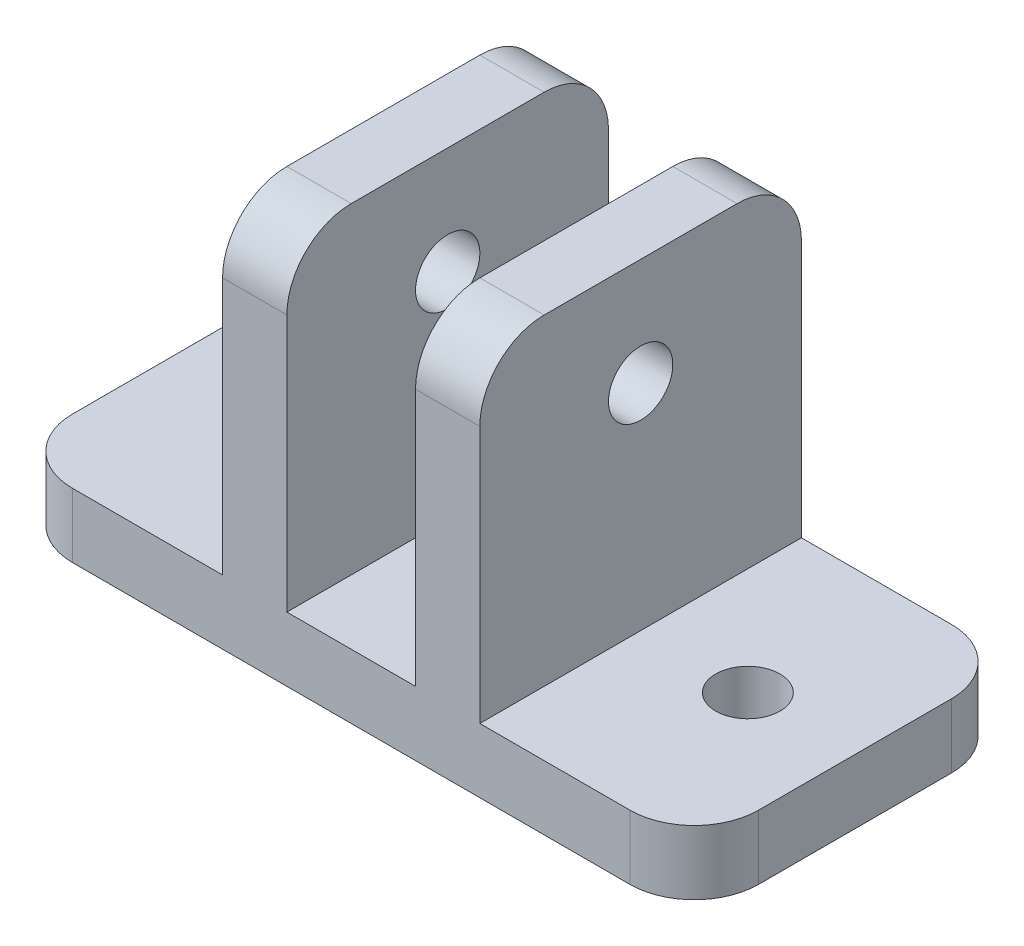
ISO-10303-21;
HEADER;
FILE_DESCRIPTION(('STEP AP214'),'2;1');
FILE_NAME('part.step','',(''),(''),'','','');
FILE_SCHEMA(('AUTOMOTIVE_DESIGN { 1 0 10303 214 1 1 1 1 }'));
ENDSEC;
DATA;
#1=APPLICATION_CONTEXT('core data for automotive mechanical design processes');
#2=APPLICATION_PROTOCOL_DEFINITION('international standard','automotive_design',2000,#1);
#3=PRODUCT_CONTEXT('',#1,'mechanical');
#4=PRODUCT('Part','Part','',(#3));
#5=PRODUCT_RELATED_PRODUCT_CATEGORY('part','',(#4));
#6=PRODUCT_DEFINITION_FORMATION('','',#4);
#7=PRODUCT_DEFINITION_CONTEXT('part definition',#1,'design');
#8=PRODUCT_DEFINITION('design','',#6,#7);
#9=PRODUCT_DEFINITION_SHAPE('','',#8);
#10=(LENGTH_UNIT() NAMED_UNIT(*) SI_UNIT(.MILLI.,.METRE.));
#11=(NAMED_UNIT(*) PLANE_ANGLE_UNIT() SI_UNIT($,.RADIAN.));
#12=(NAMED_UNIT(*) SI_UNIT($,.STERADIAN.) SOLID_ANGLE_UNIT());
#13=UNCERTAINTY_MEASURE_WITH_UNIT(LENGTH_MEASURE(1.E-05),#10,'distance_accuracy_value','');
#14=(GEOMETRIC_REPRESENTATION_CONTEXT(3) GLOBAL_UNCERTAINTY_ASSIGNED_CONTEXT((#13)) GLOBAL_UNIT_ASSIGNED_CONTEXT((#10,
#11,#12)) REPRESENTATION_CONTEXT('',''));
#15=CARTESIAN_POINT('',(0.,0.,0.));
#16=DIRECTION('',(0.,0.,1.));
#17=DIRECTION('',(1.,0.,0.));
#18=AXIS2_PLACEMENT_3D('',#15,#16,#17);
#19=CARTESIAN_POINT('',(-19.,3.,7.5));
#20=DIRECTION('',(0.,0.,-1.));
#21=DIRECTION('',(-1.,0.,0.));
#22=AXIS2_PLACEMENT_3D('',#19,#20,#21);
#23=PLANE('',#22);
#24=DIRECTION('',(-1.,0.,0.));
#25=VECTOR('',#24,1.);
#26=CARTESIAN_POINT('',(5.99999999999999,15.,7.5));
#27=LINE('',#26,#25);
#28=CARTESIAN_POINT('',(-6.00000000000002,15.,7.5));
#29=VERTEX_POINT('',#28);
#30=CARTESIAN_POINT('',(-9.00000000000001,15.,7.5));
#31=VERTEX_POINT('',#30);
#32=EDGE_CURVE('E309',#29,#31,#27,.T.);
#33=ORIENTED_EDGE('',*,*,#32,.T.);
#34=DIRECTION('',(0.,-1.,0.));
#35=VECTOR('',#34,1.);
#36=CARTESIAN_POINT('',(-9.00000000000001,18.,7.5));
#37=LINE('',#36,#35);
#38=CARTESIAN_POINT('',(-9.00000000000001,3.,7.5));
#39=VERTEX_POINT('',#38);
#40=EDGE_CURVE('E218',#31,#39,#37,.T.);
#41=ORIENTED_EDGE('',*,*,#40,.T.);
#42=DIRECTION('',(1.,0.,0.));
#43=VECTOR('',#42,1.);
#44=CARTESIAN_POINT('',(-19.,3.,7.5));
#45=LINE('',#44,#43);
#46=CARTESIAN_POINT('',(-16.,3.,7.5));
#47=VERTEX_POINT('',#46);
#48=EDGE_CURVE('E232',#47,#39,#45,.T.);
#49=ORIENTED_EDGE('',*,*,#48,.F.);
#50=DIRECTION('',(0.,1.,0.));
#51=VECTOR('',#50,1.);
#52=CARTESIAN_POINT('',(-16.,-12.,7.5));
#53=LINE('',#52,#51);
#54=CARTESIAN_POINT('',(-16.,0.,7.5));
#55=VERTEX_POINT('',#54);
#56=EDGE_CURVE('E342',#55,#47,#53,.T.);
#57=ORIENTED_EDGE('',*,*,#56,.F.);
#58=DIRECTION('',(1.,0.,0.));
#59=VECTOR('',#58,1.);
#60=CARTESIAN_POINT('',(-19.,0.,7.5));
#61=LINE('',#60,#59);
#62=CARTESIAN_POINT('',(9.99999999999998,0.,7.5));
#63=VERTEX_POINT('',#62);
#64=EDGE_CURVE('E245',#55,#63,#61,.T.);
#65=ORIENTED_EDGE('',*,*,#64,.T.);
#66=DIRECTION('',(0.,1.,0.));
#67=VECTOR('',#66,1.);
#68=CARTESIAN_POINT('',(9.99999999999998,-12.,7.5));
#69=LINE('',#68,#67);
#70=CARTESIAN_POINT('',(9.99999999999998,3.,7.5));
#71=VERTEX_POINT('',#70);
#72=EDGE_CURVE('E341',#63,#71,#69,.T.);
#73=ORIENTED_EDGE('',*,*,#72,.T.);
#74=CARTESIAN_POINT('',(2.99999999999998,3.,7.5));
#75=VERTEX_POINT('',#74);
#76=EDGE_CURVE('E231',#75,#71,#45,.T.);
#77=ORIENTED_EDGE('',*,*,#76,.F.);
#78=DIRECTION('',(0.,-1.,0.));
#79=VECTOR('',#78,1.);
#80=CARTESIAN_POINT('',(2.99999999999998,18.,7.5));
#81=LINE('',#80,#79);
#82=CARTESIAN_POINT('',(2.99999999999998,15.,7.5));
#83=VERTEX_POINT('',#82);
#84=EDGE_CURVE('E402',#83,#75,#81,.T.);
#85=ORIENTED_EDGE('',*,*,#84,.F.);
#86=CARTESIAN_POINT('',(0.,15.,7.5));
#87=VERTEX_POINT('',#86);
#88=EDGE_CURVE('E312',#83,#87,#27,.T.);
#89=ORIENTED_EDGE('',*,*,#88,.T.);
#90=DIRECTION('',(0.,-1.,0.));
#91=VECTOR('',#90,1.);
#92=CARTESIAN_POINT('',(0.,18.,7.5));
#93=LINE('',#92,#91);
#94=CARTESIAN_POINT('',(0.,3.,7.5));
#95=VERTEX_POINT('',#94);
#96=EDGE_CURVE('E405',#87,#95,#93,.T.);
#97=ORIENTED_EDGE('',*,*,#96,.T.);
#98=CARTESIAN_POINT('',(-6.00000000000002,3.,7.5));
#99=VERTEX_POINT('',#98);
#100=EDGE_CURVE('E237',#99,#95,#45,.T.);
#101=ORIENTED_EDGE('',*,*,#100,.F.);
#102=DIRECTION('',(0.,-1.,0.));
#103=VECTOR('',#102,1.);
#104=CARTESIAN_POINT('',(-6.00000000000002,18.,7.5));
#105=LINE('',#104,#103);
#106=EDGE_CURVE('E208',#29,#99,#105,.T.);
#107=ORIENTED_EDGE('',*,*,#106,.F.);
#108=EDGE_LOOP('',(#33,#41,#49,#57,#65,#73,#77,#85,#89,#97,#101,#107));
#109=FACE_BOUND('',#108,.T.);
#110=ADVANCED_FACE('F39',(#109),#23,.F.);
#111=CARTESIAN_POINT('',(0.,18.,0.));
#112=DIRECTION('',(0.,1.,0.));
#113=DIRECTION('',(0.,0.,1.));
#114=AXIS2_PLACEMENT_3D('',#111,#112,#113);
#115=PLANE('',#114);
#116=DIRECTION('',(-1.,0.,0.));
#117=VECTOR('',#116,1.);
#118=CARTESIAN_POINT('',(5.99999999999999,18.,-4.49999999999999));
#119=LINE('',#118,#117);
#120=CARTESIAN_POINT('',(-6.00000000000002,18.,-4.49999999999999));
#121=VERTEX_POINT('',#120);
#122=CARTESIAN_POINT('',(-9.00000000000001,18.,-4.49999999999999));
#123=VERTEX_POINT('',#122);
#124=EDGE_CURVE('E303',#121,#123,#119,.T.);
#125=ORIENTED_EDGE('',*,*,#124,.T.);
#126=DIRECTION('',(0.,0.,1.));
#127=VECTOR('',#126,1.);
#128=CARTESIAN_POINT('',(-9.00000000000001,18.,-7.5));
#129=LINE('',#128,#127);
#130=CARTESIAN_POINT('',(-9.00000000000001,18.,4.49999999999999));
#131=VERTEX_POINT('',#130);
#132=EDGE_CURVE('E194',#123,#131,#129,.T.);
#133=ORIENTED_EDGE('',*,*,#132,.T.);
#134=DIRECTION('',(-1.,0.,0.));
#135=VECTOR('',#134,1.);
#136=CARTESIAN_POINT('',(5.99999999999999,18.,4.49999999999999));
#137=LINE('',#136,#135);
#138=CARTESIAN_POINT('',(-6.00000000000002,18.,4.5));
#139=VERTEX_POINT('',#138);
#140=EDGE_CURVE('E196',#139,#131,#137,.T.);
#141=ORIENTED_EDGE('',*,*,#140,.F.);
#142=DIRECTION('',(0.,0.,-1.));
#143=VECTOR('',#142,1.);
#144=CARTESIAN_POINT('',(-6.00000000000002,18.,-7.5));
#145=LINE('',#144,#143);
#146=EDGE_CURVE('E204',#139,#121,#145,.T.);
#147=ORIENTED_EDGE('',*,*,#146,.T.);
#148=EDGE_LOOP('',(#125,#133,#141,#147));
#149=FACE_BOUND('',#148,.T.);
#150=ADVANCED_FACE('F485',(#149),#115,.T.);
#151=CARTESIAN_POINT('',(0.,18.,0.));
#152=DIRECTION('',(0.,1.,0.));
#153=DIRECTION('',(0.,0.,1.));
#154=AXIS2_PLACEMENT_3D('',#151,#152,#153);
#155=PLANE('',#154);
#156=DIRECTION('',(-1.,0.,0.));
#157=VECTOR('',#156,1.);
#158=CARTESIAN_POINT('',(5.99999999999999,18.,-4.5));
#159=LINE('',#158,#157);
#160=CARTESIAN_POINT('',(0.,18.,-4.5));
#161=VERTEX_POINT('',#160);
#162=CARTESIAN_POINT('',(2.99999999999998,18.,-4.49999999999999));
#163=VERTEX_POINT('',#162);
#164=EDGE_CURVE('E11',#161,#163,#159,.F.);
#165=ORIENTED_EDGE('',*,*,#164,.F.);
#166=DIRECTION('',(0.,0.,1.));
#167=VECTOR('',#166,1.);
#168=CARTESIAN_POINT('',(0.,18.,-7.5));
#169=LINE('',#168,#167);
#170=CARTESIAN_POINT('',(0.,18.,4.49999999999999));
#171=VERTEX_POINT('',#170);
#172=EDGE_CURVE('E381',#161,#171,#169,.T.);
#173=ORIENTED_EDGE('',*,*,#172,.T.);
#174=DIRECTION('',(-1.,0.,0.));
#175=VECTOR('',#174,1.);
#176=CARTESIAN_POINT('',(5.99999999999999,18.,4.5));
#177=LINE('',#176,#175);
#178=CARTESIAN_POINT('',(2.99999999999998,18.,4.5));
#179=VERTEX_POINT('',#178);
#180=EDGE_CURVE('E49',#171,#179,#177,.F.);
#181=ORIENTED_EDGE('',*,*,#180,.T.);
#182=DIRECTION('',(0.,0.,-1.));
#183=VECTOR('',#182,1.);
#184=CARTESIAN_POINT('',(2.99999999999998,18.,-7.5));
#185=LINE('',#184,#183);
#186=EDGE_CURVE('E385',#179,#163,#185,.T.);
#187=ORIENTED_EDGE('',*,*,#186,.T.);
#188=EDGE_LOOP('',(#165,#173,#181,#187));
#189=FACE_BOUND('',#188,.T.);
#190=ADVANCED_FACE('F464',(#189),#155,.T.);
#191=CARTESIAN_POINT('',(0.,3.,0.));
#192=DIRECTION('',(0.,1.,0.));
#193=DIRECTION('',(0.,0.,1.));
#194=AXIS2_PLACEMENT_3D('',#191,#192,#193);
#195=PLANE('',#194);
#196=CARTESIAN_POINT('',(7.99999999999998,3.,0.));
#197=DIRECTION('',(0.,1.,0.));
#198=DIRECTION('',(0.,0.,1.));
#199=AXIS2_PLACEMENT_3D('',#196,#197,#198);
#200=CIRCLE('',#199,1.5);
#201=CARTESIAN_POINT('',(7.99999999999998,3.,1.5));
#202=VERTEX_POINT('',#201);
#203=EDGE_CURVE('E284',#202,#202,#200,.T.);
#204=ORIENTED_EDGE('',*,*,#203,.F.);
#205=EDGE_LOOP('',(#204));
#206=FACE_BOUND('',#205,.T.);
#207=CARTESIAN_POINT('',(9.99999999999998,3.,-4.5));
#208=DIRECTION('',(0.,1.,0.));
#209=DIRECTION('',(0.,0.,1.));
#210=AXIS2_PLACEMENT_3D('',#207,#208,#209);
#211=CIRCLE('',#210,3.);
#212=CARTESIAN_POINT('',(9.99999999999998,3.,-7.5));
#213=VERTEX_POINT('',#212);
#214=CARTESIAN_POINT('',(13.,3.,-4.5));
#215=VERTEX_POINT('',#214);
#216=EDGE_CURVE('E335',#213,#215,#211,.F.);
#217=ORIENTED_EDGE('',*,*,#216,.F.);
#218=DIRECTION('',(-1.,0.,0.));
#219=VECTOR('',#218,1.);
#220=CARTESIAN_POINT('',(-19.,3.,-7.5));
#221=LINE('',#220,#219);
#222=CARTESIAN_POINT('',(2.99999999999998,3.,-7.5));
#223=VERTEX_POINT('',#222);
#224=EDGE_CURVE('E222',#213,#223,#221,.T.);
#225=ORIENTED_EDGE('',*,*,#224,.T.);
#226=DIRECTION('',(0.,0.,-1.));
#227=VECTOR('',#226,1.);
#228=CARTESIAN_POINT('',(2.99999999999998,3.,-7.5));
#229=LINE('',#228,#227);
#230=EDGE_CURVE('E386',#75,#223,#229,.T.);
#231=ORIENTED_EDGE('',*,*,#230,.F.);
#232=ORIENTED_EDGE('',*,*,#76,.T.);
#233=CARTESIAN_POINT('',(9.99999999999998,3.,4.5));
#234=DIRECTION('',(0.,1.,0.));
#235=DIRECTION('',(0.,0.,1.));
#236=AXIS2_PLACEMENT_3D('',#233,#234,#235);
#237=CIRCLE('',#236,3.);
#238=CARTESIAN_POINT('',(13.,3.,4.5));
#239=VERTEX_POINT('',#238);
#240=EDGE_CURVE('E349',#239,#71,#237,.F.);
#241=ORIENTED_EDGE('',*,*,#240,.F.);
#242=DIRECTION('',(0.,0.,1.));
#243=VECTOR('',#242,1.);
#244=CARTESIAN_POINT('',(13.,3.,-7.5));
#245=LINE('',#244,#243);
#246=EDGE_CURVE('E376',#215,#239,#245,.T.);
#247=ORIENTED_EDGE('',*,*,#246,.F.);
#248=EDGE_LOOP('',(#217,#225,#231,#232,#241,#247));
#249=FACE_BOUND('',#248,.T.);
#250=ADVANCED_FACE('F436',(#206,#249),#195,.T.);
#251=CARTESIAN_POINT('',(-14.,3.,0.));
#252=DIRECTION('',(0.,1.,0.));
#253=DIRECTION('',(0.,0.,1.));
#254=AXIS2_PLACEMENT_3D('',#251,#252,#253);
#255=CIRCLE('',#254,1.5);
#256=CARTESIAN_POINT('',(-14.,3.,1.5));
#257=VERTEX_POINT('',#256);
#258=EDGE_CURVE('E277',#257,#257,#255,.T.);
#259=ORIENTED_EDGE('',*,*,#258,.F.);
#260=EDGE_LOOP('',(#259));
#261=FACE_BOUND('',#260,.T.);
#262=DIRECTION('',(0.,0.,1.));
#263=VECTOR('',#262,1.);
#264=CARTESIAN_POINT('',(-19.,3.,-7.5));
#265=LINE('',#264,#263);
#266=CARTESIAN_POINT('',(-19.,3.,-4.5));
#267=VERTEX_POINT('',#266);
#268=CARTESIAN_POINT('',(-19.,3.,4.5));
#269=VERTEX_POINT('',#268);
#270=EDGE_CURVE('E226',#267,#269,#265,.T.);
#271=ORIENTED_EDGE('',*,*,#270,.T.);
#272=CARTESIAN_POINT('',(-16.,3.,4.5));
#273=DIRECTION('',(0.,1.,0.));
#274=DIRECTION('',(0.,0.,1.));
#275=AXIS2_PLACEMENT_3D('',#272,#273,#274);
#276=CIRCLE('',#275,3.);
#277=EDGE_CURVE('E336',#269,#47,#276,.T.);
#278=ORIENTED_EDGE('',*,*,#277,.T.);
#279=ORIENTED_EDGE('',*,*,#48,.T.);
#280=DIRECTION('',(0.,0.,1.));
#281=VECTOR('',#280,1.);
#282=CARTESIAN_POINT('',(-9.00000000000001,3.,-7.5));
#283=LINE('',#282,#281);
#284=CARTESIAN_POINT('',(-9.00000000000001,3.,-7.5));
#285=VERTEX_POINT('',#284);
#286=EDGE_CURVE('E408',#285,#39,#283,.T.);
#287=ORIENTED_EDGE('',*,*,#286,.F.);
#288=CARTESIAN_POINT('',(-16.,3.,-7.5));
#289=VERTEX_POINT('',#288);
#290=EDGE_CURVE('E201',#285,#289,#221,.T.);
#291=ORIENTED_EDGE('',*,*,#290,.T.);
#292=CARTESIAN_POINT('',(-16.,3.,-4.5));
#293=DIRECTION('',(0.,1.,0.));
#294=DIRECTION('',(0.,0.,1.));
#295=AXIS2_PLACEMENT_3D('',#292,#293,#294);
#296=CIRCLE('',#295,3.);
#297=EDGE_CURVE('E345',#267,#289,#296,.F.);
#298=ORIENTED_EDGE('',*,*,#297,.F.);
#299=EDGE_LOOP('',(#271,#278,#279,#287,#291,#298));
#300=FACE_BOUND('',#299,.T.);
#301=ADVANCED_FACE('F503',(#261,#300),#195,.T.);
#302=CARTESIAN_POINT('',(-19.,3.,-7.5));
#303=DIRECTION('',(0.,0.,1.));
#304=DIRECTION('',(1.,0.,0.));
#305=AXIS2_PLACEMENT_3D('',#302,#303,#304);
#306=PLANE('',#305);
#307=DIRECTION('',(0.,-1.,0.));
#308=VECTOR('',#307,1.);
#309=CARTESIAN_POINT('',(-9.00000000000001,18.,-7.5));
#310=LINE('',#309,#308);
#311=CARTESIAN_POINT('',(-9.00000000000001,15.,-7.5));
#312=VERTEX_POINT('',#311);
#313=EDGE_CURVE('E190',#312,#285,#310,.T.);
#314=ORIENTED_EDGE('',*,*,#313,.F.);
#315=DIRECTION('',(-1.,0.,0.));
#316=VECTOR('',#315,1.);
#317=CARTESIAN_POINT('',(5.99999999999999,15.,-7.5));
#318=LINE('',#317,#316);
#319=CARTESIAN_POINT('',(-6.00000000000002,15.,-7.5));
#320=VERTEX_POINT('',#319);
#321=EDGE_CURVE('E176',#320,#312,#318,.T.);
#322=ORIENTED_EDGE('',*,*,#321,.F.);
#323=DIRECTION('',(0.,-1.,0.));
#324=VECTOR('',#323,1.);
#325=CARTESIAN_POINT('',(-6.00000000000002,18.,-7.5));
#326=LINE('',#325,#324);
#327=CARTESIAN_POINT('',(-6.00000000000002,3.,-7.5));
#328=VERTEX_POINT('',#327);
#329=EDGE_CURVE('E203',#320,#328,#326,.T.);
#330=ORIENTED_EDGE('',*,*,#329,.T.);
#331=CARTESIAN_POINT('',(0.,3.,-7.5));
#332=VERTEX_POINT('',#331);
#333=EDGE_CURVE('E227',#332,#328,#221,.T.);
#334=ORIENTED_EDGE('',*,*,#333,.F.);
#335=DIRECTION('',(0.,-1.,0.));
#336=VECTOR('',#335,1.);
#337=CARTESIAN_POINT('',(0.,18.,-7.5));
#338=LINE('',#337,#336);
#339=CARTESIAN_POINT('',(0.,15.,-7.5));
#340=VERTEX_POINT('',#339);
#341=EDGE_CURVE('E390',#340,#332,#338,.T.);
#342=ORIENTED_EDGE('',*,*,#341,.F.);
#343=CARTESIAN_POINT('',(2.99999999999998,15.,-7.5));
#344=VERTEX_POINT('',#343);
#345=EDGE_CURVE('E184',#344,#340,#318,.T.);
#346=ORIENTED_EDGE('',*,*,#345,.F.);
#347=DIRECTION('',(0.,-1.,0.));
#348=VECTOR('',#347,1.);
#349=CARTESIAN_POINT('',(2.99999999999998,18.,-7.5));
#350=LINE('',#349,#348);
#351=EDGE_CURVE('E399',#344,#223,#350,.T.);
#352=ORIENTED_EDGE('',*,*,#351,.T.);
#353=ORIENTED_EDGE('',*,*,#224,.F.);
#354=DIRECTION('',(0.,1.,0.));
#355=VECTOR('',#354,1.);
#356=CARTESIAN_POINT('',(9.99999999999998,-12.,-7.5));
#357=LINE('',#356,#355);
#358=CARTESIAN_POINT('',(9.99999999999998,0.,-7.5));
#359=VERTEX_POINT('',#358);
#360=EDGE_CURVE('E352',#359,#213,#357,.T.);
#361=ORIENTED_EDGE('',*,*,#360,.F.);
#362=DIRECTION('',(-1.,0.,0.));
#363=VECTOR('',#362,1.);
#364=CARTESIAN_POINT('',(-19.,0.,-7.5));
#365=LINE('',#364,#363);
#366=CARTESIAN_POINT('',(-16.,0.,-7.5));
#367=VERTEX_POINT('',#366);
#368=EDGE_CURVE('E221',#359,#367,#365,.T.);
#369=ORIENTED_EDGE('',*,*,#368,.T.);
#370=DIRECTION('',(0.,1.,0.));
#371=VECTOR('',#370,1.);
#372=CARTESIAN_POINT('',(-16.,-12.,-7.5));
#373=LINE('',#372,#371);
#374=EDGE_CURVE('E363',#367,#289,#373,.T.);
#375=ORIENTED_EDGE('',*,*,#374,.T.);
#376=ORIENTED_EDGE('',*,*,#290,.F.);
#377=EDGE_LOOP('',(#314,#322,#330,#334,#342,#346,#352,#353,#361,#369,#375,#376));
#378=FACE_BOUND('',#377,.T.);
#379=ADVANCED_FACE('F41',(#378),#306,.F.);
#380=CARTESIAN_POINT('',(0.,0.,0.));
#381=DIRECTION('',(0.,1.,0.));
#382=DIRECTION('',(0.,0.,1.));
#383=AXIS2_PLACEMENT_3D('',#380,#381,#382);
#384=PLANE('',#383);
#385=CARTESIAN_POINT('',(-14.,0.,0.));
#386=DIRECTION('',(0.,1.,0.));
#387=DIRECTION('',(0.,0.,1.));
#388=AXIS2_PLACEMENT_3D('',#385,#386,#387);
#389=CIRCLE('',#388,1.5);
#390=CARTESIAN_POINT('',(-14.,0.,1.5));
#391=VERTEX_POINT('',#390);
#392=EDGE_CURVE('E43',#391,#391,#389,.T.);
#393=ORIENTED_EDGE('',*,*,#392,.T.);
#394=EDGE_LOOP('',(#393));
#395=FACE_BOUND('',#394,.T.);
#396=CARTESIAN_POINT('',(7.99999999999998,0.,0.));
#397=DIRECTION('',(0.,1.,0.));
#398=DIRECTION('',(0.,0.,1.));
#399=AXIS2_PLACEMENT_3D('',#396,#397,#398);
#400=CIRCLE('',#399,1.5);
#401=CARTESIAN_POINT('',(7.99999999999998,0.,1.5));
#402=VERTEX_POINT('',#401);
#403=EDGE_CURVE('E274',#402,#402,#400,.T.);
#404=ORIENTED_EDGE('',*,*,#403,.T.);
#405=EDGE_LOOP('',(#404));
#406=FACE_BOUND('',#405,.T.);
#407=ORIENTED_EDGE('',*,*,#368,.F.);
#408=CARTESIAN_POINT('',(9.99999999999998,0.,-4.5));
#409=DIRECTION('',(0.,1.,0.));
#410=DIRECTION('',(0.,0.,1.));
#411=AXIS2_PLACEMENT_3D('',#408,#409,#410);
#412=CIRCLE('',#411,3.);
#413=CARTESIAN_POINT('',(13.,0.,-4.5));
#414=VERTEX_POINT('',#413);
#415=EDGE_CURVE('E372',#359,#414,#412,.F.);
#416=ORIENTED_EDGE('',*,*,#415,.T.);
#417=DIRECTION('',(0.,0.,1.));
#418=VECTOR('',#417,1.);
#419=CARTESIAN_POINT('',(13.,0.,0.));
#420=LINE('',#419,#418);
#421=CARTESIAN_POINT('',(13.,0.,4.5));
#422=VERTEX_POINT('',#421);
#423=EDGE_CURVE('E236',#414,#422,#420,.T.);
#424=ORIENTED_EDGE('',*,*,#423,.T.);
#425=CARTESIAN_POINT('',(9.99999999999998,0.,4.5));
#426=DIRECTION('',(0.,1.,0.));
#427=DIRECTION('',(0.,0.,1.));
#428=AXIS2_PLACEMENT_3D('',#425,#426,#427);
#429=CIRCLE('',#428,3.);
#430=EDGE_CURVE('E366',#422,#63,#429,.F.);
#431=ORIENTED_EDGE('',*,*,#430,.T.);
#432=ORIENTED_EDGE('',*,*,#64,.F.);
#433=CARTESIAN_POINT('',(-16.,0.,4.5));
#434=DIRECTION('',(0.,1.,0.));
#435=DIRECTION('',(0.,0.,1.));
#436=AXIS2_PLACEMENT_3D('',#433,#434,#435);
#437=CIRCLE('',#436,3.);
#438=CARTESIAN_POINT('',(-19.,0.,4.5));
#439=VERTEX_POINT('',#438);
#440=EDGE_CURVE('E263',#439,#55,#437,.T.);
#441=ORIENTED_EDGE('',*,*,#440,.F.);
#442=DIRECTION('',(0.,0.,1.));
#443=VECTOR('',#442,1.);
#444=CARTESIAN_POINT('',(-19.,0.,-7.5));
#445=LINE('',#444,#443);
#446=CARTESIAN_POINT('',(-19.,0.,-4.5));
#447=VERTEX_POINT('',#446);
#448=EDGE_CURVE('E241',#447,#439,#445,.T.);
#449=ORIENTED_EDGE('',*,*,#448,.F.);
#450=CARTESIAN_POINT('',(-16.,0.,-4.5));
#451=DIRECTION('',(0.,1.,0.));
#452=DIRECTION('',(0.,0.,1.));
#453=AXIS2_PLACEMENT_3D('',#450,#451,#452);
#454=CIRCLE('',#453,3.);
#455=EDGE_CURVE('E259',#447,#367,#454,.F.);
#456=ORIENTED_EDGE('',*,*,#455,.T.);
#457=EDGE_LOOP('',(#407,#416,#424,#431,#432,#441,#449,#456));
#458=FACE_BOUND('',#457,.T.);
#459=ADVANCED_FACE('F445',(#395,#406,#458),#384,.F.);
#460=CARTESIAN_POINT('',(13.,-12.,-7.5));
#461=DIRECTION('',(-1.,0.,0.));
#462=DIRECTION('',(0.,0.,1.));
#463=AXIS2_PLACEMENT_3D('',#460,#461,#462);
#464=PLANE('',#463);
#465=DIRECTION('',(0.,1.,0.));
#466=VECTOR('',#465,1.);
#467=CARTESIAN_POINT('',(13.,-12.,-4.5));
#468=LINE('',#467,#466);
#469=EDGE_CURVE('E256',#215,#414,#468,.F.);
#470=ORIENTED_EDGE('',*,*,#469,.F.);
#471=ORIENTED_EDGE('',*,*,#246,.T.);
#472=DIRECTION('',(0.,1.,0.));
#473=VECTOR('',#472,1.);
#474=CARTESIAN_POINT('',(13.,-12.,4.5));
#475=LINE('',#474,#473);
#476=EDGE_CURVE('E252',#239,#422,#475,.F.);
#477=ORIENTED_EDGE('',*,*,#476,.T.);
#478=ORIENTED_EDGE('',*,*,#423,.F.);
#479=EDGE_LOOP('',(#470,#471,#477,#478));
#480=FACE_BOUND('',#479,.T.);
#481=ADVANCED_FACE('F450',(#480),#464,.F.);
#482=ORIENTED_EDGE('',*,*,#100,.T.);
#483=DIRECTION('',(0.,0.,1.));
#484=VECTOR('',#483,1.);
#485=CARTESIAN_POINT('',(0.,3.,-7.5));
#486=LINE('',#485,#484);
#487=EDGE_CURVE('E380',#332,#95,#486,.T.);
#488=ORIENTED_EDGE('',*,*,#487,.F.);
#489=ORIENTED_EDGE('',*,*,#333,.T.);
#490=DIRECTION('',(0.,0.,-1.));
#491=VECTOR('',#490,1.);
#492=CARTESIAN_POINT('',(-6.00000000000002,3.,-7.5));
#493=LINE('',#492,#491);
#494=EDGE_CURVE('E213',#99,#328,#493,.T.);
#495=ORIENTED_EDGE('',*,*,#494,.F.);
#496=EDGE_LOOP('',(#482,#488,#489,#495));
#497=FACE_BOUND('',#496,.T.);
#498=ADVANCED_FACE('F422',(#497),#195,.T.);
#499=CARTESIAN_POINT('',(-19.,3.,-7.5));
#500=DIRECTION('',(1.,0.,0.));
#501=DIRECTION('',(0.,0.,-1.));
#502=AXIS2_PLACEMENT_3D('',#499,#500,#501);
#503=PLANE('',#502);
#504=ORIENTED_EDGE('',*,*,#448,.T.);
#505=DIRECTION('',(0.,1.,0.));
#506=VECTOR('',#505,1.);
#507=CARTESIAN_POINT('',(-19.,-12.,4.5));
#508=LINE('',#507,#506);
#509=EDGE_CURVE('E340',#439,#269,#508,.T.);
#510=ORIENTED_EDGE('',*,*,#509,.T.);
#511=ORIENTED_EDGE('',*,*,#270,.F.);
#512=DIRECTION('',(0.,1.,0.));
#513=VECTOR('',#512,1.);
#514=CARTESIAN_POINT('',(-19.,-12.,-4.5));
#515=LINE('',#514,#513);
#516=EDGE_CURVE('E362',#447,#267,#515,.T.);
#517=ORIENTED_EDGE('',*,*,#516,.F.);
#518=EDGE_LOOP('',(#504,#510,#511,#517));
#519=FACE_BOUND('',#518,.T.);
#520=ADVANCED_FACE('F494',(#519),#503,.F.);
#521=CARTESIAN_POINT('',(-9.00000000000001,18.,-7.5));
#522=DIRECTION('',(1.,0.,0.));
#523=DIRECTION('',(0.,0.,-1.));
#524=AXIS2_PLACEMENT_3D('',#521,#522,#523);
#525=PLANE('',#524);
#526=CARTESIAN_POINT('',(-9.00000000000001,13.,0.));
#527=DIRECTION('',(-1.,0.,0.));
#528=DIRECTION('',(0.,0.,1.));
#529=AXIS2_PLACEMENT_3D('',#526,#527,#528);
#530=CIRCLE('',#529,1.5);
#531=CARTESIAN_POINT('',(-9.00000000000001,13.,1.5));
#532=VERTEX_POINT('',#531);
#533=EDGE_CURVE('E273',#532,#532,#530,.T.);
#534=ORIENTED_EDGE('',*,*,#533,.F.);
#535=EDGE_LOOP('',(#534));
#536=FACE_BOUND('',#535,.T.);
#537=ORIENTED_EDGE('',*,*,#132,.F.);
#538=CARTESIAN_POINT('',(-9.00000000000001,15.,-4.5));
#539=DIRECTION('',(1.,0.,0.));
#540=DIRECTION('',(0.,0.,-1.));
#541=AXIS2_PLACEMENT_3D('',#538,#539,#540);
#542=CIRCLE('',#541,3.);
#543=EDGE_CURVE('E65',#312,#123,#542,.T.);
#544=ORIENTED_EDGE('',*,*,#543,.F.);
#545=ORIENTED_EDGE('',*,*,#313,.T.);
#546=ORIENTED_EDGE('',*,*,#286,.T.);
#547=ORIENTED_EDGE('',*,*,#40,.F.);
#548=CARTESIAN_POINT('',(-9.00000000000001,15.,4.5));
#549=DIRECTION('',(1.,0.,0.));
#550=DIRECTION('',(0.,0.,1.));
#551=AXIS2_PLACEMENT_3D('',#548,#549,#550);
#552=CIRCLE('',#551,3.);
#553=EDGE_CURVE('E301',#131,#31,#552,.T.);
#554=ORIENTED_EDGE('',*,*,#553,.F.);
#555=EDGE_LOOP('',(#537,#544,#545,#546,#547,#554));
#556=FACE_BOUND('',#555,.T.);
#557=ADVANCED_FACE('F188',(#536,#556),#525,.F.);
#558=CARTESIAN_POINT('',(-6.00000000000002,18.,-7.5));
#559=DIRECTION('',(-1.,0.,0.));
#560=DIRECTION('',(0.,0.,1.));
#561=AXIS2_PLACEMENT_3D('',#558,#559,#560);
#562=PLANE('',#561);
#563=CARTESIAN_POINT('',(-6.00000000000002,13.,0.));
#564=DIRECTION('',(-1.,0.,0.));
#565=DIRECTION('',(0.,0.,1.));
#566=AXIS2_PLACEMENT_3D('',#563,#564,#565);
#567=CIRCLE('',#566,1.5);
#568=CARTESIAN_POINT('',(-6.00000000000002,13.,1.5));
#569=VERTEX_POINT('',#568);
#570=EDGE_CURVE('E298',#569,#569,#567,.T.);
#571=ORIENTED_EDGE('',*,*,#570,.T.);
#572=EDGE_LOOP('',(#571));
#573=FACE_BOUND('',#572,.T.);
#574=ORIENTED_EDGE('',*,*,#329,.F.);
#575=CARTESIAN_POINT('',(-6.00000000000002,15.,-4.5));
#576=DIRECTION('',(-1.,0.,0.));
#577=DIRECTION('',(0.,0.,1.));
#578=AXIS2_PLACEMENT_3D('',#575,#576,#577);
#579=CIRCLE('',#578,3.);
#580=EDGE_CURVE('E179',#320,#121,#579,.F.);
#581=ORIENTED_EDGE('',*,*,#580,.T.);
#582=ORIENTED_EDGE('',*,*,#146,.F.);
#583=CARTESIAN_POINT('',(-6.00000000000002,15.,4.5));
#584=DIRECTION('',(-1.,0.,0.));
#585=DIRECTION('',(0.,0.,1.));
#586=AXIS2_PLACEMENT_3D('',#583,#584,#585);
#587=CIRCLE('',#586,3.);
#588=EDGE_CURVE('E57',#139,#29,#587,.F.);
#589=ORIENTED_EDGE('',*,*,#588,.T.);
#590=ORIENTED_EDGE('',*,*,#106,.T.);
#591=ORIENTED_EDGE('',*,*,#494,.T.);
#592=EDGE_LOOP('',(#574,#581,#582,#589,#590,#591));
#593=FACE_BOUND('',#592,.T.);
#594=ADVANCED_FACE('F416',(#573,#593),#562,.F.);
#595=CARTESIAN_POINT('',(0.,18.,-7.5));
#596=DIRECTION('',(1.,0.,0.));
#597=DIRECTION('',(0.,0.,-1.));
#598=AXIS2_PLACEMENT_3D('',#595,#596,#597);
#599=PLANE('',#598);
#600=CARTESIAN_POINT('',(0.,13.,0.));
#601=DIRECTION('',(1.,0.,0.));
#602=DIRECTION('',(0.,0.,-1.));
#603=AXIS2_PLACEMENT_3D('',#600,#601,#602);
#604=CIRCLE('',#603,1.5);
#605=CARTESIAN_POINT('',(0.,13.,-1.5));
#606=VERTEX_POINT('',#605);
#607=EDGE_CURVE('E272',#606,#606,#604,.T.);
#608=ORIENTED_EDGE('',*,*,#607,.T.);
#609=EDGE_LOOP('',(#608));
#610=FACE_BOUND('',#609,.T.);
#611=ORIENTED_EDGE('',*,*,#172,.F.);
#612=CARTESIAN_POINT('',(0.,15.,-4.5));
#613=DIRECTION('',(1.,0.,0.));
#614=DIRECTION('',(0.,0.,-1.));
#615=AXIS2_PLACEMENT_3D('',#612,#613,#614);
#616=CIRCLE('',#615,3.);
#617=EDGE_CURVE('E329',#161,#340,#616,.F.);
#618=ORIENTED_EDGE('',*,*,#617,.T.);
#619=ORIENTED_EDGE('',*,*,#341,.T.);
#620=ORIENTED_EDGE('',*,*,#487,.T.);
#621=ORIENTED_EDGE('',*,*,#96,.F.);
#622=CARTESIAN_POINT('',(0.,15.,4.5));
#623=DIRECTION('',(1.,0.,0.));
#624=DIRECTION('',(0.,0.,-1.));
#625=AXIS2_PLACEMENT_3D('',#622,#623,#624);
#626=CIRCLE('',#625,3.);
#627=EDGE_CURVE('E319',#87,#171,#626,.F.);
#628=ORIENTED_EDGE('',*,*,#627,.T.);
#629=EDGE_LOOP('',(#611,#618,#619,#620,#621,#628));
#630=FACE_BOUND('',#629,.T.);
#631=ADVANCED_FACE('F467',(#610,#630),#599,.F.);
#632=CARTESIAN_POINT('',(2.99999999999998,18.,-7.5));
#633=DIRECTION('',(-1.,0.,0.));
#634=DIRECTION('',(0.,0.,1.));
#635=AXIS2_PLACEMENT_3D('',#632,#633,#634);
#636=PLANE('',#635);
#637=CARTESIAN_POINT('',(2.99999999999998,13.,0.));
#638=DIRECTION('',(-1.,0.,0.));
#639=DIRECTION('',(0.,0.,1.));
#640=AXIS2_PLACEMENT_3D('',#637,#638,#639);
#641=CIRCLE('',#640,1.5);
#642=CARTESIAN_POINT('',(2.99999999999998,13.,1.5));
#643=VERTEX_POINT('',#642);
#644=EDGE_CURVE('E269',#643,#643,#641,.T.);
#645=ORIENTED_EDGE('',*,*,#644,.T.);
#646=EDGE_LOOP('',(#645));
#647=FACE_BOUND('',#646,.T.);
#648=ORIENTED_EDGE('',*,*,#351,.F.);
#649=CARTESIAN_POINT('',(2.99999999999998,15.,-4.5));
#650=DIRECTION('',(-1.,0.,0.));
#651=DIRECTION('',(0.,0.,1.));
#652=AXIS2_PLACEMENT_3D('',#649,#650,#651);
#653=CIRCLE('',#652,3.);
#654=EDGE_CURVE('E325',#344,#163,#653,.F.);
#655=ORIENTED_EDGE('',*,*,#654,.T.);
#656=ORIENTED_EDGE('',*,*,#186,.F.);
#657=CARTESIAN_POINT('',(2.99999999999998,15.,4.5));
#658=DIRECTION('',(-1.,0.,0.));
#659=DIRECTION('',(0.,0.,1.));
#660=AXIS2_PLACEMENT_3D('',#657,#658,#659);
#661=CIRCLE('',#660,3.);
#662=EDGE_CURVE('E305',#179,#83,#661,.F.);
#663=ORIENTED_EDGE('',*,*,#662,.T.);
#664=ORIENTED_EDGE('',*,*,#84,.T.);
#665=ORIENTED_EDGE('',*,*,#230,.T.);
#666=EDGE_LOOP('',(#648,#655,#656,#663,#664,#665));
#667=FACE_BOUND('',#666,.T.);
#668=ADVANCED_FACE('F458',(#647,#667),#636,.F.);
#669=CARTESIAN_POINT('',(9.99999999999998,-12.,4.5));
#670=DIRECTION('',(0.,1.,0.));
#671=DIRECTION('',(0.,0.,1.));
#672=AXIS2_PLACEMENT_3D('',#669,#670,#671);
#673=CYLINDRICAL_SURFACE('',#672,3.);
#674=ORIENTED_EDGE('',*,*,#476,.F.);
#675=ORIENTED_EDGE('',*,*,#240,.T.);
#676=ORIENTED_EDGE('',*,*,#72,.F.);
#677=ORIENTED_EDGE('',*,*,#430,.F.);
#678=EDGE_LOOP('',(#674,#675,#676,#677));
#679=FACE_BOUND('',#678,.T.);
#680=ADVANCED_FACE('F442',(#679),#673,.T.);
#681=CARTESIAN_POINT('',(9.99999999999998,-12.,-4.5));
#682=DIRECTION('',(0.,1.,0.));
#683=DIRECTION('',(0.,0.,1.));
#684=AXIS2_PLACEMENT_3D('',#681,#682,#683);
#685=CYLINDRICAL_SURFACE('',#684,3.);
#686=ORIENTED_EDGE('',*,*,#360,.T.);
#687=ORIENTED_EDGE('',*,*,#216,.T.);
#688=ORIENTED_EDGE('',*,*,#469,.T.);
#689=ORIENTED_EDGE('',*,*,#415,.F.);
#690=EDGE_LOOP('',(#686,#687,#688,#689));
#691=FACE_BOUND('',#690,.T.);
#692=ADVANCED_FACE('F514',(#691),#685,.T.);
#693=CARTESIAN_POINT('',(-16.,-12.,-4.5));
#694=DIRECTION('',(0.,1.,0.));
#695=DIRECTION('',(0.,0.,1.));
#696=AXIS2_PLACEMENT_3D('',#693,#694,#695);
#697=CYLINDRICAL_SURFACE('',#696,3.);
#698=ORIENTED_EDGE('',*,*,#516,.T.);
#699=ORIENTED_EDGE('',*,*,#297,.T.);
#700=ORIENTED_EDGE('',*,*,#374,.F.);
#701=ORIENTED_EDGE('',*,*,#455,.F.);
#702=EDGE_LOOP('',(#698,#699,#700,#701));
#703=FACE_BOUND('',#702,.T.);
#704=ADVANCED_FACE('F512',(#703),#697,.T.);
#705=CARTESIAN_POINT('',(-16.,-12.,4.5));
#706=DIRECTION('',(0.,1.,0.));
#707=DIRECTION('',(0.,0.,1.));
#708=AXIS2_PLACEMENT_3D('',#705,#706,#707);
#709=CYLINDRICAL_SURFACE('',#708,3.);
#710=ORIENTED_EDGE('',*,*,#440,.T.);
#711=ORIENTED_EDGE('',*,*,#56,.T.);
#712=ORIENTED_EDGE('',*,*,#277,.F.);
#713=ORIENTED_EDGE('',*,*,#509,.F.);
#714=EDGE_LOOP('',(#710,#711,#712,#713));
#715=FACE_BOUND('',#714,.T.);
#716=ADVANCED_FACE('F480',(#715),#709,.T.);
#717=CARTESIAN_POINT('',(5.99999999999999,15.,4.5));
#718=DIRECTION('',(-1.,0.,0.));
#719=DIRECTION('',(0.,0.,1.));
#720=AXIS2_PLACEMENT_3D('',#717,#718,#719);
#721=CYLINDRICAL_SURFACE('',#720,3.);
#722=ORIENTED_EDGE('',*,*,#88,.F.);
#723=ORIENTED_EDGE('',*,*,#662,.F.);
#724=ORIENTED_EDGE('',*,*,#180,.F.);
#725=ORIENTED_EDGE('',*,*,#627,.F.);
#726=EDGE_LOOP('',(#722,#723,#724,#725));
#727=FACE_BOUND('',#726,.T.);
#728=ADVANCED_FACE('F461',(#727),#721,.T.);
#729=CARTESIAN_POINT('',(5.99999999999999,15.,-4.5));
#730=DIRECTION('',(-1.,0.,0.));
#731=DIRECTION('',(0.,0.,1.));
#732=AXIS2_PLACEMENT_3D('',#729,#730,#731);
#733=CYLINDRICAL_SURFACE('',#732,3.);
#734=ORIENTED_EDGE('',*,*,#164,.T.);
#735=ORIENTED_EDGE('',*,*,#654,.F.);
#736=ORIENTED_EDGE('',*,*,#345,.T.);
#737=ORIENTED_EDGE('',*,*,#617,.F.);
#738=EDGE_LOOP('',(#734,#735,#736,#737));
#739=FACE_BOUND('',#738,.T.);
#740=ADVANCED_FACE('F471',(#739),#733,.T.);
#741=ORIENTED_EDGE('',*,*,#140,.T.);
#742=ORIENTED_EDGE('',*,*,#553,.T.);
#743=ORIENTED_EDGE('',*,*,#32,.F.);
#744=ORIENTED_EDGE('',*,*,#588,.F.);
#745=EDGE_LOOP('',(#741,#742,#743,#744));
#746=FACE_BOUND('',#745,.T.);
#747=ADVANCED_FACE('F473',(#746),#721,.T.);
#748=ORIENTED_EDGE('',*,*,#321,.T.);
#749=ORIENTED_EDGE('',*,*,#543,.T.);
#750=ORIENTED_EDGE('',*,*,#124,.F.);
#751=ORIENTED_EDGE('',*,*,#580,.F.);
#752=EDGE_LOOP('',(#748,#749,#750,#751));
#753=FACE_BOUND('',#752,.T.);
#754=ADVANCED_FACE('F177',(#753),#733,.T.);
#755=CARTESIAN_POINT('',(5.99999999999999,13.,0.));
#756=DIRECTION('',(-1.,0.,0.));
#757=DIRECTION('',(0.,0.,1.));
#758=AXIS2_PLACEMENT_3D('',#755,#756,#757);
#759=CYLINDRICAL_SURFACE('',#758,1.5);
#760=ORIENTED_EDGE('',*,*,#644,.F.);
#761=EDGE_LOOP('',(#760));
#762=FACE_BOUND('',#761,.T.);
#763=ORIENTED_EDGE('',*,*,#607,.F.);
#764=EDGE_LOOP('',(#763));
#765=FACE_BOUND('',#764,.T.);
#766=ADVANCED_FACE('F483',(#762,#765),#759,.F.);
#767=ORIENTED_EDGE('',*,*,#533,.T.);
#768=EDGE_LOOP('',(#767));
#769=FACE_BOUND('',#768,.T.);
#770=ORIENTED_EDGE('',*,*,#570,.F.);
#771=EDGE_LOOP('',(#770));
#772=FACE_BOUND('',#771,.T.);
#773=ADVANCED_FACE('F540',(#769,#772),#759,.F.);
#774=CARTESIAN_POINT('',(7.99999999999998,-12.,0.));
#775=DIRECTION('',(0.,1.,0.));
#776=DIRECTION('',(0.,0.,1.));
#777=AXIS2_PLACEMENT_3D('',#774,#775,#776);
#778=CYLINDRICAL_SURFACE('',#777,1.5);
#779=ORIENTED_EDGE('',*,*,#203,.T.);
#780=EDGE_LOOP('',(#779));
#781=FACE_BOUND('',#780,.T.);
#782=ORIENTED_EDGE('',*,*,#403,.F.);
#783=EDGE_LOOP('',(#782));
#784=FACE_BOUND('',#783,.T.);
#785=ADVANCED_FACE('F542',(#781,#784),#778,.F.);
#786=CARTESIAN_POINT('',(-14.,-12.,0.));
#787=DIRECTION('',(0.,1.,0.));
#788=DIRECTION('',(0.,0.,1.));
#789=AXIS2_PLACEMENT_3D('',#786,#787,#788);
#790=CYLINDRICAL_SURFACE('',#789,1.5);
#791=ORIENTED_EDGE('',*,*,#258,.T.);
#792=EDGE_LOOP('',(#791));
#793=FACE_BOUND('',#792,.T.);
#794=ORIENTED_EDGE('',*,*,#392,.F.);
#795=EDGE_LOOP('',(#794));
#796=FACE_BOUND('',#795,.T.);
#797=ADVANCED_FACE('F548',(#793,#796),#790,.F.);
#798=CLOSED_SHELL('',(#110,#150,#190,#250,#301,#379,#459,#481,#498,#520,#557,#594,#631,#668,
#680,#692,#704,#716,#728,#740,#747,#754,#766,#773,#785,#797));
#799=MANIFOLD_SOLID_BREP('B2',#798);
#800=ADVANCED_BREP_SHAPE_REPRESENTATION('',(#18,#799),#14);
#801=SHAPE_DEFINITION_REPRESENTATION(#9,#800);
ENDSEC;
END-ISO-10303-21;
